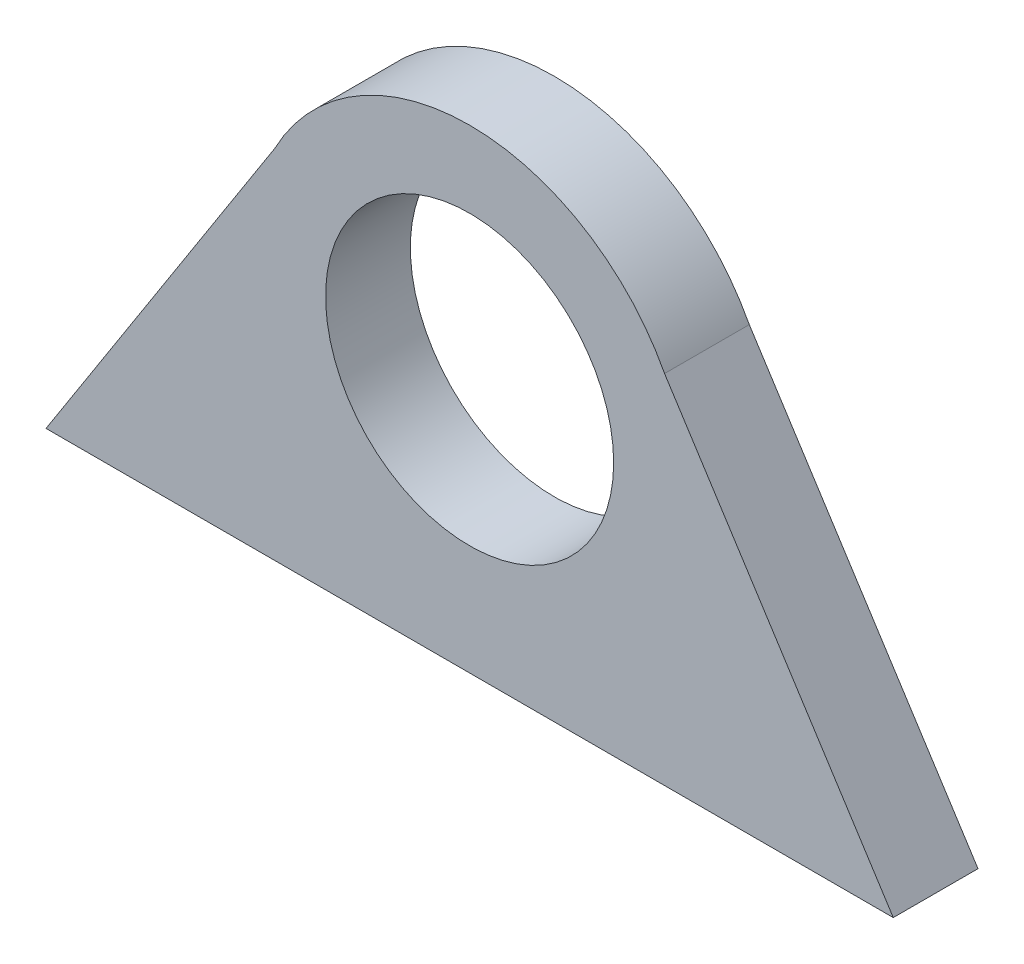
ISO-10303-21;
HEADER;
FILE_DESCRIPTION(('STEP AP214'),'2;1');
FILE_NAME('part.step','',(''),(''),'','','');
FILE_SCHEMA(('AUTOMOTIVE_DESIGN { 1 0 10303 214 1 1 1 1 }'));
ENDSEC;
DATA;
#1=APPLICATION_CONTEXT('core data for automotive mechanical design processes');
#2=APPLICATION_PROTOCOL_DEFINITION('international standard','automotive_design',2000,#1);
#3=PRODUCT_CONTEXT('',#1,'mechanical');
#4=PRODUCT('Part','Part','',(#3));
#5=PRODUCT_RELATED_PRODUCT_CATEGORY('part','',(#4));
#6=PRODUCT_DEFINITION_FORMATION('','',#4);
#7=PRODUCT_DEFINITION_CONTEXT('part definition',#1,'design');
#8=PRODUCT_DEFINITION('design','',#6,#7);
#9=PRODUCT_DEFINITION_SHAPE('','',#8);
#10=(LENGTH_UNIT() NAMED_UNIT(*) SI_UNIT(.MILLI.,.METRE.));
#11=(NAMED_UNIT(*) PLANE_ANGLE_UNIT() SI_UNIT($,.RADIAN.));
#12=(NAMED_UNIT(*) SI_UNIT($,.STERADIAN.) SOLID_ANGLE_UNIT());
#13=UNCERTAINTY_MEASURE_WITH_UNIT(LENGTH_MEASURE(1.E-05),#10,'distance_accuracy_value','');
#14=(GEOMETRIC_REPRESENTATION_CONTEXT(3) GLOBAL_UNCERTAINTY_ASSIGNED_CONTEXT((#13)) GLOBAL_UNIT_ASSIGNED_CONTEXT((#10,
#11,#12)) REPRESENTATION_CONTEXT('',''));
#15=CARTESIAN_POINT('',(0.,0.,0.));
#16=DIRECTION('',(0.,0.,1.));
#17=DIRECTION('',(1.,0.,0.));
#18=AXIS2_PLACEMENT_3D('',#15,#16,#17);
#19=CARTESIAN_POINT('',(0.,0.,5.));
#20=DIRECTION('',(0.,0.,1.));
#21=DIRECTION('',(1.,0.,0.));
#22=AXIS2_PLACEMENT_3D('',#19,#20,#21);
#23=PLANE('',#22);
#24=DIRECTION('',(-0.539645855633138,0.841892125214376,0.));
#25=VECTOR('',#24,1.);
#26=CARTESIAN_POINT('',(25.,-15.,5.));
#27=LINE('',#26,#25);
#28=CARTESIAN_POINT('',(25.,-15.,5.));
#29=VERTEX_POINT('',#28);
#30=CARTESIAN_POINT('',(11.5031419014593,6.05621386634349,5.));
#31=VERTEX_POINT('',#30);
#32=EDGE_CURVE('E92',#29,#31,#27,.T.);
#33=ORIENTED_EDGE('',*,*,#32,.T.);
#34=CARTESIAN_POINT('',(0.,0.,5.));
#35=DIRECTION('',(0.,0.,1.));
#36=DIRECTION('',(1.,0.,0.));
#37=AXIS2_PLACEMENT_3D('',#34,#35,#36);
#38=CIRCLE('',#37,13.);
#39=CARTESIAN_POINT('',(-11.5041388624181,6.05431986553414,5.));
#40=VERTEX_POINT('',#39);
#41=EDGE_CURVE('E87',#31,#40,#38,.T.);
#42=ORIENTED_EDGE('',*,*,#41,.T.);
#43=DIRECTION('',(-0.539652007975923,-0.841888181582064,0.));
#44=VECTOR('',#43,1.);
#45=CARTESIAN_POINT('',(-25.,-15.,5.));
#46=LINE('',#45,#44);
#47=CARTESIAN_POINT('',(-25.,-15.,5.));
#48=VERTEX_POINT('',#47);
#49=EDGE_CURVE('E90',#40,#48,#46,.T.);
#50=ORIENTED_EDGE('',*,*,#49,.T.);
#51=DIRECTION('',(1.,0.,0.));
#52=VECTOR('',#51,1.);
#53=CARTESIAN_POINT('',(-25.,-15.,5.));
#54=LINE('',#53,#52);
#55=EDGE_CURVE('E57',#48,#29,#54,.T.);
#56=ORIENTED_EDGE('',*,*,#55,.T.);
#57=EDGE_LOOP('',(#33,#42,#50,#56));
#58=FACE_BOUND('',#57,.T.);
#59=CARTESIAN_POINT('',(0.,0.,5.));
#60=DIRECTION('',(0.,0.,1.));
#61=DIRECTION('',(1.,0.,0.));
#62=AXIS2_PLACEMENT_3D('',#59,#60,#61);
#63=CIRCLE('',#62,8.5);
#64=CARTESIAN_POINT('',(8.5,0.,5.));
#65=VERTEX_POINT('',#64);
#66=EDGE_CURVE('E112',#65,#65,#63,.T.);
#67=ORIENTED_EDGE('',*,*,#66,.F.);
#68=EDGE_LOOP('',(#67));
#69=FACE_BOUND('',#68,.T.);
#70=ADVANCED_FACE('F39',(#58,#69),#23,.T.);
#71=CARTESIAN_POINT('',(0.,0.,0.));
#72=DIRECTION('',(0.,0.,1.));
#73=DIRECTION('',(1.,0.,0.));
#74=AXIS2_PLACEMENT_3D('',#71,#72,#73);
#75=PLANE('',#74);
#76=DIRECTION('',(-0.539645855633138,0.841892125214376,0.));
#77=VECTOR('',#76,1.);
#78=CARTESIAN_POINT('',(25.,-15.,0.));
#79=LINE('',#78,#77);
#80=CARTESIAN_POINT('',(25.,-15.,0.));
#81=VERTEX_POINT('',#80);
#82=CARTESIAN_POINT('',(11.5031419014593,6.05621386634349,0.));
#83=VERTEX_POINT('',#82);
#84=EDGE_CURVE('E108',#81,#83,#79,.T.);
#85=ORIENTED_EDGE('',*,*,#84,.F.);
#86=DIRECTION('',(1.,0.,0.));
#87=VECTOR('',#86,1.);
#88=CARTESIAN_POINT('',(-25.,-15.,0.));
#89=LINE('',#88,#87);
#90=CARTESIAN_POINT('',(-25.,-15.,0.));
#91=VERTEX_POINT('',#90);
#92=EDGE_CURVE('E80',#91,#81,#89,.T.);
#93=ORIENTED_EDGE('',*,*,#92,.F.);
#94=DIRECTION('',(-0.539652007975923,-0.841888181582064,0.));
#95=VECTOR('',#94,1.);
#96=CARTESIAN_POINT('',(-25.,-15.,0.));
#97=LINE('',#96,#95);
#98=CARTESIAN_POINT('',(-11.5041388624181,6.05431986553414,0.));
#99=VERTEX_POINT('',#98);
#100=EDGE_CURVE('E74',#99,#91,#97,.T.);
#101=ORIENTED_EDGE('',*,*,#100,.F.);
#102=CARTESIAN_POINT('',(0.,0.,0.));
#103=DIRECTION('',(0.,0.,1.));
#104=DIRECTION('',(1.,0.,0.));
#105=AXIS2_PLACEMENT_3D('',#102,#103,#104);
#106=CIRCLE('',#105,13.);
#107=EDGE_CURVE('E97',#83,#99,#106,.T.);
#108=ORIENTED_EDGE('',*,*,#107,.F.);
#109=EDGE_LOOP('',(#85,#93,#101,#108));
#110=FACE_BOUND('',#109,.T.);
#111=CARTESIAN_POINT('',(0.,0.,0.));
#112=DIRECTION('',(0.,0.,1.));
#113=DIRECTION('',(1.,0.,0.));
#114=AXIS2_PLACEMENT_3D('',#111,#112,#113);
#115=CIRCLE('',#114,8.5);
#116=CARTESIAN_POINT('',(8.5,0.,0.));
#117=VERTEX_POINT('',#116);
#118=EDGE_CURVE('E130',#117,#117,#115,.T.);
#119=ORIENTED_EDGE('',*,*,#118,.T.);
#120=EDGE_LOOP('',(#119));
#121=FACE_BOUND('',#120,.T.);
#122=ADVANCED_FACE('F125',(#110,#121),#75,.F.);
#123=CARTESIAN_POINT('',(25.,-15.,5.));
#124=DIRECTION('',(-0.841892125214376,-0.539645855633138,0.));
#125=DIRECTION('',(0.539645855633138,-0.841892125214376,0.));
#126=AXIS2_PLACEMENT_3D('',#123,#124,#125);
#127=PLANE('',#126);
#128=ORIENTED_EDGE('',*,*,#84,.T.);
#129=DIRECTION('',(0.,0.,-1.));
#130=VECTOR('',#129,1.);
#131=CARTESIAN_POINT('',(11.5031419014593,6.05621386634349,5.));
#132=LINE('',#131,#130);
#133=EDGE_CURVE('E11',#31,#83,#132,.T.);
#134=ORIENTED_EDGE('',*,*,#133,.F.);
#135=ORIENTED_EDGE('',*,*,#32,.F.);
#136=DIRECTION('',(0.,0.,-1.));
#137=VECTOR('',#136,1.);
#138=CARTESIAN_POINT('',(25.,-15.,5.));
#139=LINE('',#138,#137);
#140=EDGE_CURVE('E104',#29,#81,#139,.T.);
#141=ORIENTED_EDGE('',*,*,#140,.T.);
#142=EDGE_LOOP('',(#128,#134,#135,#141));
#143=FACE_BOUND('',#142,.T.);
#144=ADVANCED_FACE('F41',(#143),#127,.F.);
#145=CARTESIAN_POINT('',(0.,0.,5.));
#146=DIRECTION('',(0.,0.,-1.));
#147=DIRECTION('',(-1.,0.,0.));
#148=AXIS2_PLACEMENT_3D('',#145,#146,#147);
#149=CYLINDRICAL_SURFACE('',#148,13.);
#150=ORIENTED_EDGE('',*,*,#107,.T.);
#151=DIRECTION('',(0.,0.,-1.));
#152=VECTOR('',#151,1.);
#153=CARTESIAN_POINT('',(-11.5041388624181,6.05431986553414,5.));
#154=LINE('',#153,#152);
#155=EDGE_CURVE('E49',#40,#99,#154,.T.);
#156=ORIENTED_EDGE('',*,*,#155,.F.);
#157=ORIENTED_EDGE('',*,*,#41,.F.);
#158=ORIENTED_EDGE('',*,*,#133,.T.);
#159=EDGE_LOOP('',(#150,#156,#157,#158));
#160=FACE_BOUND('',#159,.T.);
#161=ADVANCED_FACE('F96',(#160),#149,.T.);
#162=CARTESIAN_POINT('',(-25.,-15.,5.));
#163=DIRECTION('',(0.841888181582064,-0.539652007975923,0.));
#164=DIRECTION('',(0.539652007975923,0.841888181582064,0.));
#165=AXIS2_PLACEMENT_3D('',#162,#163,#164);
#166=PLANE('',#165);
#167=ORIENTED_EDGE('',*,*,#100,.T.);
#168=DIRECTION('',(0.,0.,-1.));
#169=VECTOR('',#168,1.);
#170=CARTESIAN_POINT('',(-25.,-15.,5.));
#171=LINE('',#170,#169);
#172=EDGE_CURVE('E99',#48,#91,#171,.T.);
#173=ORIENTED_EDGE('',*,*,#172,.F.);
#174=ORIENTED_EDGE('',*,*,#49,.F.);
#175=ORIENTED_EDGE('',*,*,#155,.T.);
#176=EDGE_LOOP('',(#167,#173,#174,#175));
#177=FACE_BOUND('',#176,.T.);
#178=ADVANCED_FACE('F100',(#177),#166,.F.);
#179=CARTESIAN_POINT('',(-25.,-15.,5.));
#180=DIRECTION('',(0.,1.,0.));
#181=DIRECTION('',(-1.,0.,0.));
#182=AXIS2_PLACEMENT_3D('',#179,#180,#181);
#183=PLANE('',#182);
#184=ORIENTED_EDGE('',*,*,#92,.T.);
#185=ORIENTED_EDGE('',*,*,#140,.F.);
#186=ORIENTED_EDGE('',*,*,#55,.F.);
#187=ORIENTED_EDGE('',*,*,#172,.T.);
#188=EDGE_LOOP('',(#184,#185,#186,#187));
#189=FACE_BOUND('',#188,.T.);
#190=ADVANCED_FACE('F122',(#189),#183,.F.);
#191=CARTESIAN_POINT('',(0.,0.,5.));
#192=DIRECTION('',(0.,0.,-1.));
#193=DIRECTION('',(-1.,0.,0.));
#194=AXIS2_PLACEMENT_3D('',#191,#192,#193);
#195=CYLINDRICAL_SURFACE('',#194,8.5);
#196=ORIENTED_EDGE('',*,*,#66,.T.);
#197=EDGE_LOOP('',(#196));
#198=FACE_BOUND('',#197,.T.);
#199=ORIENTED_EDGE('',*,*,#118,.F.);
#200=EDGE_LOOP('',(#199));
#201=FACE_BOUND('',#200,.T.);
#202=ADVANCED_FACE('F138',(#198,#201),#195,.F.);
#203=CLOSED_SHELL('',(#70,#122,#144,#161,#178,#190,#202));
#204=MANIFOLD_SOLID_BREP('B2',#203);
#205=ADVANCED_BREP_SHAPE_REPRESENTATION('',(#18,#204),#14);
#206=SHAPE_DEFINITION_REPRESENTATION(#9,#205);
ENDSEC;
END-ISO-10303-21;
